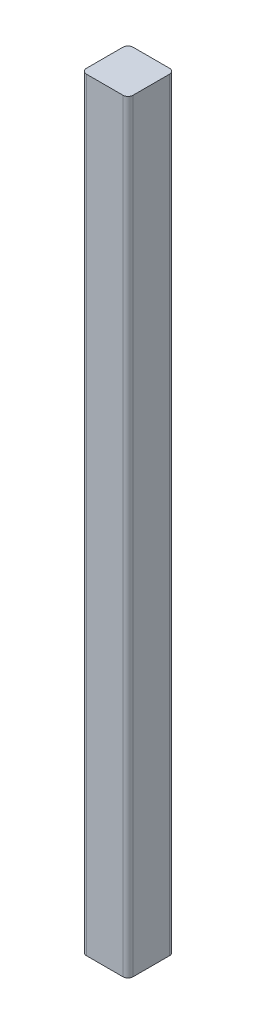
ISO-10303-21;
HEADER;
FILE_DESCRIPTION(('STEP AP214'),'2;1');
FILE_NAME('part.step','',(''),(''),'','','');
FILE_SCHEMA(('AUTOMOTIVE_DESIGN { 1 0 10303 214 1 1 1 1 }'));
ENDSEC;
DATA;
#1=APPLICATION_CONTEXT('core data for automotive mechanical design processes');
#2=APPLICATION_PROTOCOL_DEFINITION('international standard','automotive_design',2000,#1);
#3=PRODUCT_CONTEXT('',#1,'mechanical');
#4=PRODUCT('Part','Part','',(#3));
#5=PRODUCT_RELATED_PRODUCT_CATEGORY('part','',(#4));
#6=PRODUCT_DEFINITION_FORMATION('','',#4);
#7=PRODUCT_DEFINITION_CONTEXT('part definition',#1,'design');
#8=PRODUCT_DEFINITION('design','',#6,#7);
#9=PRODUCT_DEFINITION_SHAPE('','',#8);
#10=(LENGTH_UNIT() NAMED_UNIT(*) SI_UNIT(.MILLI.,.METRE.));
#11=(NAMED_UNIT(*) PLANE_ANGLE_UNIT() SI_UNIT($,.RADIAN.));
#12=(NAMED_UNIT(*) SI_UNIT($,.STERADIAN.) SOLID_ANGLE_UNIT());
#13=UNCERTAINTY_MEASURE_WITH_UNIT(LENGTH_MEASURE(1.E-05),#10,'distance_accuracy_value','');
#14=(GEOMETRIC_REPRESENTATION_CONTEXT(3) GLOBAL_UNCERTAINTY_ASSIGNED_CONTEXT((#13)) GLOBAL_UNIT_ASSIGNED_CONTEXT((#10,
#11,#12)) REPRESENTATION_CONTEXT('',''));
#15=CARTESIAN_POINT('',(0.,0.,0.));
#16=DIRECTION('',(0.,0.,1.));
#17=DIRECTION('',(1.,0.,0.));
#18=AXIS2_PLACEMENT_3D('',#15,#16,#17);
#19=CARTESIAN_POINT('',(22.8,419.01,2.8));
#20=DIRECTION('',(0.,-1.,0.));
#21=DIRECTION('',(0.,0.,-1.));
#22=AXIS2_PLACEMENT_3D('',#19,#20,#21);
#23=CYLINDRICAL_SURFACE('',#22,2.8);
#24=CARTESIAN_POINT('',(22.8,0.,2.8));
#25=DIRECTION('',(0.,1.,0.));
#26=DIRECTION('',(0.,0.,-1.));
#27=AXIS2_PLACEMENT_3D('',#24,#25,#26);
#28=CIRCLE('',#27,2.8);
#29=CARTESIAN_POINT('',(25.6,0.,2.80000000000002));
#30=VERTEX_POINT('',#29);
#31=CARTESIAN_POINT('',(22.8,0.,0.));
#32=VERTEX_POINT('',#31);
#33=EDGE_CURVE('E140',#30,#32,#28,.T.);
#34=ORIENTED_EDGE('',*,*,#33,.T.);
#35=DIRECTION('',(0.,-1.,0.));
#36=VECTOR('',#35,1.);
#37=CARTESIAN_POINT('',(22.8,419.01,0.));
#38=LINE('',#37,#36);
#39=CARTESIAN_POINT('',(22.8,419.01,0.));
#40=VERTEX_POINT('',#39);
#41=EDGE_CURVE('E11',#40,#32,#38,.T.);
#42=ORIENTED_EDGE('',*,*,#41,.F.);
#43=CARTESIAN_POINT('',(22.8,419.01,2.8));
#44=DIRECTION('',(0.,1.,0.));
#45=DIRECTION('',(0.,0.,-1.));
#46=AXIS2_PLACEMENT_3D('',#43,#44,#45);
#47=CIRCLE('',#46,2.8);
#48=CARTESIAN_POINT('',(25.6,419.01,2.80000000000002));
#49=VERTEX_POINT('',#48);
#50=EDGE_CURVE('E156',#49,#40,#47,.T.);
#51=ORIENTED_EDGE('',*,*,#50,.F.);
#52=DIRECTION('',(0.,-1.,0.));
#53=VECTOR('',#52,1.);
#54=CARTESIAN_POINT('',(25.6,419.01,2.80000000000002));
#55=LINE('',#54,#53);
#56=EDGE_CURVE('E136',#49,#30,#55,.T.);
#57=ORIENTED_EDGE('',*,*,#56,.T.);
#58=EDGE_LOOP('',(#34,#42,#51,#57));
#59=FACE_BOUND('',#58,.T.);
#60=ADVANCED_FACE('F32',(#59),#23,.T.);
#61=CARTESIAN_POINT('',(2.80000000000002,419.01,0.));
#62=DIRECTION('',(0.,0.,1.));
#63=DIRECTION('',(1.,0.,0.));
#64=AXIS2_PLACEMENT_3D('',#61,#62,#63);
#65=PLANE('',#64);
#66=DIRECTION('',(-1.,0.,0.));
#67=VECTOR('',#66,1.);
#68=CARTESIAN_POINT('',(2.80000000000002,0.,0.));
#69=LINE('',#68,#67);
#70=CARTESIAN_POINT('',(2.80000000000002,0.,0.));
#71=VERTEX_POINT('',#70);
#72=EDGE_CURVE('E143',#32,#71,#69,.T.);
#73=ORIENTED_EDGE('',*,*,#72,.T.);
#74=DIRECTION('',(0.,-1.,0.));
#75=VECTOR('',#74,1.);
#76=CARTESIAN_POINT('',(2.80000000000002,419.01,0.));
#77=LINE('',#76,#75);
#78=CARTESIAN_POINT('',(2.80000000000002,419.01,0.));
#79=VERTEX_POINT('',#78);
#80=EDGE_CURVE('E39',#79,#71,#77,.T.);
#81=ORIENTED_EDGE('',*,*,#80,.F.);
#82=DIRECTION('',(-1.,0.,0.));
#83=VECTOR('',#82,1.);
#84=CARTESIAN_POINT('',(2.80000000000002,419.01,0.));
#85=LINE('',#84,#83);
#86=EDGE_CURVE('E96',#40,#79,#85,.T.);
#87=ORIENTED_EDGE('',*,*,#86,.F.);
#88=ORIENTED_EDGE('',*,*,#41,.T.);
#89=EDGE_LOOP('',(#73,#81,#87,#88));
#90=FACE_BOUND('',#89,.T.);
#91=ADVANCED_FACE('F259',(#90),#65,.F.);
#92=CARTESIAN_POINT('',(2.8,419.01,2.8));
#93=DIRECTION('',(0.,-1.,0.));
#94=DIRECTION('',(0.,0.,-1.));
#95=AXIS2_PLACEMENT_3D('',#92,#93,#94);
#96=CYLINDRICAL_SURFACE('',#95,2.8);
#97=CARTESIAN_POINT('',(2.8,0.,2.8));
#98=DIRECTION('',(0.,1.,0.));
#99=DIRECTION('',(0.,0.,1.));
#100=AXIS2_PLACEMENT_3D('',#97,#98,#99);
#101=CIRCLE('',#100,2.8);
#102=CARTESIAN_POINT('',(0.,0.,2.80000000000002));
#103=VERTEX_POINT('',#102);
#104=EDGE_CURVE('E146',#71,#103,#101,.T.);
#105=ORIENTED_EDGE('',*,*,#104,.T.);
#106=DIRECTION('',(0.,-1.,0.));
#107=VECTOR('',#106,1.);
#108=CARTESIAN_POINT('',(0.,419.01,2.80000000000002));
#109=LINE('',#108,#107);
#110=CARTESIAN_POINT('',(0.,419.01,2.80000000000002));
#111=VERTEX_POINT('',#110);
#112=EDGE_CURVE('E163',#111,#103,#109,.T.);
#113=ORIENTED_EDGE('',*,*,#112,.F.);
#114=CARTESIAN_POINT('',(2.8,419.01,2.8));
#115=DIRECTION('',(0.,1.,0.));
#116=DIRECTION('',(0.,0.,1.));
#117=AXIS2_PLACEMENT_3D('',#114,#115,#116);
#118=CIRCLE('',#117,2.8);
#119=EDGE_CURVE('E171',#79,#111,#118,.T.);
#120=ORIENTED_EDGE('',*,*,#119,.F.);
#121=ORIENTED_EDGE('',*,*,#80,.T.);
#122=EDGE_LOOP('',(#105,#113,#120,#121));
#123=FACE_BOUND('',#122,.T.);
#124=ADVANCED_FACE('F169',(#123),#96,.T.);
#125=CARTESIAN_POINT('',(0.,419.01,2.80000000000002));
#126=DIRECTION('',(1.,0.,0.));
#127=DIRECTION('',(0.,0.,-1.));
#128=AXIS2_PLACEMENT_3D('',#125,#126,#127);
#129=PLANE('',#128);
#130=DIRECTION('',(0.,0.,1.));
#131=VECTOR('',#130,1.);
#132=CARTESIAN_POINT('',(0.,0.,2.80000000000002));
#133=LINE('',#132,#131);
#134=CARTESIAN_POINT('',(0.,0.,22.8));
#135=VERTEX_POINT('',#134);
#136=EDGE_CURVE('E148',#103,#135,#133,.T.);
#137=ORIENTED_EDGE('',*,*,#136,.T.);
#138=DIRECTION('',(0.,-1.,0.));
#139=VECTOR('',#138,1.);
#140=CARTESIAN_POINT('',(0.,419.01,22.8));
#141=LINE('',#140,#139);
#142=CARTESIAN_POINT('',(0.,419.01,22.8));
#143=VERTEX_POINT('',#142);
#144=EDGE_CURVE('E160',#143,#135,#141,.T.);
#145=ORIENTED_EDGE('',*,*,#144,.F.);
#146=DIRECTION('',(0.,0.,1.));
#147=VECTOR('',#146,1.);
#148=CARTESIAN_POINT('',(0.,419.01,2.80000000000002));
#149=LINE('',#148,#147);
#150=EDGE_CURVE('E183',#111,#143,#149,.T.);
#151=ORIENTED_EDGE('',*,*,#150,.F.);
#152=ORIENTED_EDGE('',*,*,#112,.T.);
#153=EDGE_LOOP('',(#137,#145,#151,#152));
#154=FACE_BOUND('',#153,.T.);
#155=ADVANCED_FACE('F179',(#154),#129,.F.);
#156=CARTESIAN_POINT('',(2.8,419.01,22.8));
#157=DIRECTION('',(0.,-1.,0.));
#158=DIRECTION('',(0.,0.,-1.));
#159=AXIS2_PLACEMENT_3D('',#156,#157,#158);
#160=CYLINDRICAL_SURFACE('',#159,2.8);
#161=CARTESIAN_POINT('',(2.8,0.,22.8));
#162=DIRECTION('',(0.,1.,0.));
#163=DIRECTION('',(0.,0.,1.));
#164=AXIS2_PLACEMENT_3D('',#161,#162,#163);
#165=CIRCLE('',#164,2.8);
#166=CARTESIAN_POINT('',(2.80000000000002,0.,25.6));
#167=VERTEX_POINT('',#166);
#168=EDGE_CURVE('E150',#135,#167,#165,.T.);
#169=ORIENTED_EDGE('',*,*,#168,.T.);
#170=DIRECTION('',(0.,-1.,0.));
#171=VECTOR('',#170,1.);
#172=CARTESIAN_POINT('',(2.80000000000002,419.01,25.6));
#173=LINE('',#172,#171);
#174=CARTESIAN_POINT('',(2.80000000000002,419.01,25.6));
#175=VERTEX_POINT('',#174);
#176=EDGE_CURVE('E131',#175,#167,#173,.T.);
#177=ORIENTED_EDGE('',*,*,#176,.F.);
#178=CARTESIAN_POINT('',(2.8,419.01,22.8));
#179=DIRECTION('',(0.,1.,0.));
#180=DIRECTION('',(0.,0.,1.));
#181=AXIS2_PLACEMENT_3D('',#178,#179,#180);
#182=CIRCLE('',#181,2.8);
#183=EDGE_CURVE('E119',#143,#175,#182,.T.);
#184=ORIENTED_EDGE('',*,*,#183,.F.);
#185=ORIENTED_EDGE('',*,*,#144,.T.);
#186=EDGE_LOOP('',(#169,#177,#184,#185));
#187=FACE_BOUND('',#186,.T.);
#188=ADVANCED_FACE('F182',(#187),#160,.T.);
#189=CARTESIAN_POINT('',(2.80000000000002,419.01,25.6));
#190=DIRECTION('',(0.,0.,-1.));
#191=DIRECTION('',(-1.,0.,0.));
#192=AXIS2_PLACEMENT_3D('',#189,#190,#191);
#193=PLANE('',#192);
#194=DIRECTION('',(1.,0.,0.));
#195=VECTOR('',#194,1.);
#196=CARTESIAN_POINT('',(2.80000000000002,0.,25.6));
#197=LINE('',#196,#195);
#198=CARTESIAN_POINT('',(22.8,0.,25.6));
#199=VERTEX_POINT('',#198);
#200=EDGE_CURVE('E128',#167,#199,#197,.T.);
#201=ORIENTED_EDGE('',*,*,#200,.T.);
#202=DIRECTION('',(0.,-1.,0.));
#203=VECTOR('',#202,1.);
#204=CARTESIAN_POINT('',(22.8,419.01,25.6));
#205=LINE('',#204,#203);
#206=CARTESIAN_POINT('',(22.8,419.01,25.6));
#207=VERTEX_POINT('',#206);
#208=EDGE_CURVE('E125',#207,#199,#205,.T.);
#209=ORIENTED_EDGE('',*,*,#208,.F.);
#210=DIRECTION('',(1.,0.,0.));
#211=VECTOR('',#210,1.);
#212=CARTESIAN_POINT('',(2.80000000000002,419.01,25.6));
#213=LINE('',#212,#211);
#214=EDGE_CURVE('E112',#175,#207,#213,.T.);
#215=ORIENTED_EDGE('',*,*,#214,.F.);
#216=ORIENTED_EDGE('',*,*,#176,.T.);
#217=EDGE_LOOP('',(#201,#209,#215,#216));
#218=FACE_BOUND('',#217,.T.);
#219=ADVANCED_FACE('F126',(#218),#193,.F.);
#220=CARTESIAN_POINT('',(22.8,419.01,22.8));
#221=DIRECTION('',(0.,-1.,0.));
#222=DIRECTION('',(0.,0.,-1.));
#223=AXIS2_PLACEMENT_3D('',#220,#221,#222);
#224=CYLINDRICAL_SURFACE('',#223,2.8);
#225=CARTESIAN_POINT('',(22.8,0.,22.8));
#226=DIRECTION('',(0.,1.,0.));
#227=DIRECTION('',(0.,0.,1.));
#228=AXIS2_PLACEMENT_3D('',#225,#226,#227);
#229=CIRCLE('',#228,2.8);
#230=CARTESIAN_POINT('',(25.6,0.,22.8));
#231=VERTEX_POINT('',#230);
#232=EDGE_CURVE('E153',#199,#231,#229,.T.);
#233=ORIENTED_EDGE('',*,*,#232,.T.);
#234=DIRECTION('',(0.,-1.,0.));
#235=VECTOR('',#234,1.);
#236=CARTESIAN_POINT('',(25.6,419.01,22.8));
#237=LINE('',#236,#235);
#238=CARTESIAN_POINT('',(25.6,419.01,22.8));
#239=VERTEX_POINT('',#238);
#240=EDGE_CURVE('E132',#239,#231,#237,.T.);
#241=ORIENTED_EDGE('',*,*,#240,.F.);
#242=CARTESIAN_POINT('',(22.8,419.01,22.8));
#243=DIRECTION('',(0.,1.,0.));
#244=DIRECTION('',(0.,0.,1.));
#245=AXIS2_PLACEMENT_3D('',#242,#243,#244);
#246=CIRCLE('',#245,2.8);
#247=EDGE_CURVE('E116',#207,#239,#246,.T.);
#248=ORIENTED_EDGE('',*,*,#247,.F.);
#249=ORIENTED_EDGE('',*,*,#208,.T.);
#250=EDGE_LOOP('',(#233,#241,#248,#249));
#251=FACE_BOUND('',#250,.T.);
#252=ADVANCED_FACE('F134',(#251),#224,.T.);
#253=CARTESIAN_POINT('',(25.6,419.01,2.80000000000002));
#254=DIRECTION('',(-1.,0.,0.));
#255=DIRECTION('',(0.,0.,1.));
#256=AXIS2_PLACEMENT_3D('',#253,#254,#255);
#257=PLANE('',#256);
#258=DIRECTION('',(0.,0.,-1.));
#259=VECTOR('',#258,1.);
#260=CARTESIAN_POINT('',(25.6,0.,2.80000000000002));
#261=LINE('',#260,#259);
#262=EDGE_CURVE('E88',#231,#30,#261,.T.);
#263=ORIENTED_EDGE('',*,*,#262,.T.);
#264=ORIENTED_EDGE('',*,*,#56,.F.);
#265=DIRECTION('',(0.,0.,-1.));
#266=VECTOR('',#265,1.);
#267=CARTESIAN_POINT('',(25.6,419.01,2.80000000000002));
#268=LINE('',#267,#266);
#269=EDGE_CURVE('E55',#239,#49,#268,.T.);
#270=ORIENTED_EDGE('',*,*,#269,.F.);
#271=ORIENTED_EDGE('',*,*,#240,.T.);
#272=EDGE_LOOP('',(#263,#264,#270,#271));
#273=FACE_BOUND('',#272,.T.);
#274=ADVANCED_FACE('F266',(#273),#257,.F.);
#275=CARTESIAN_POINT('',(22.8,419.01,2.8));
#276=DIRECTION('',(0.,-1.,0.));
#277=DIRECTION('',(0.,0.,-1.));
#278=AXIS2_PLACEMENT_3D('',#275,#276,#277);
#279=PLANE('',#278);
#280=ORIENTED_EDGE('',*,*,#50,.T.);
#281=ORIENTED_EDGE('',*,*,#86,.T.);
#282=ORIENTED_EDGE('',*,*,#119,.T.);
#283=ORIENTED_EDGE('',*,*,#150,.T.);
#284=ORIENTED_EDGE('',*,*,#183,.T.);
#285=ORIENTED_EDGE('',*,*,#214,.T.);
#286=ORIENTED_EDGE('',*,*,#247,.T.);
#287=ORIENTED_EDGE('',*,*,#269,.T.);
#288=EDGE_LOOP('',(#280,#281,#282,#283,#284,#285,#286,#287));
#289=FACE_BOUND('',#288,.T.);
#290=ADVANCED_FACE('F114',(#289),#279,.F.);
#291=CARTESIAN_POINT('',(22.8,0.,2.8));
#292=DIRECTION('',(0.,-1.,0.));
#293=DIRECTION('',(0.,0.,-1.));
#294=AXIS2_PLACEMENT_3D('',#291,#292,#293);
#295=PLANE('',#294);
#296=DIRECTION('',(0.,0.,1.));
#297=VECTOR('',#296,1.);
#298=CARTESIAN_POINT('',(22.8,0.,2.8));
#299=LINE('',#298,#297);
#300=CARTESIAN_POINT('',(22.8,0.,2.8));
#301=VERTEX_POINT('',#300);
#302=CARTESIAN_POINT('',(22.8,0.,22.8));
#303=VERTEX_POINT('',#302);
#304=EDGE_CURVE('E46',#301,#303,#299,.T.);
#305=ORIENTED_EDGE('',*,*,#304,.F.);
#306=DIRECTION('',(1.,0.,0.));
#307=VECTOR('',#306,1.);
#308=CARTESIAN_POINT('',(2.8,0.,2.8));
#309=LINE('',#308,#307);
#310=CARTESIAN_POINT('',(2.8,0.,2.8));
#311=VERTEX_POINT('',#310);
#312=EDGE_CURVE('E199',#311,#301,#309,.T.);
#313=ORIENTED_EDGE('',*,*,#312,.F.);
#314=DIRECTION('',(0.,0.,-1.));
#315=VECTOR('',#314,1.);
#316=CARTESIAN_POINT('',(2.8,0.,2.8));
#317=LINE('',#316,#315);
#318=CARTESIAN_POINT('',(2.8,0.,22.8));
#319=VERTEX_POINT('',#318);
#320=EDGE_CURVE('E203',#319,#311,#317,.T.);
#321=ORIENTED_EDGE('',*,*,#320,.F.);
#322=DIRECTION('',(-1.,0.,0.));
#323=VECTOR('',#322,1.);
#324=CARTESIAN_POINT('',(2.8,0.,22.8));
#325=LINE('',#324,#323);
#326=EDGE_CURVE('E206',#303,#319,#325,.T.);
#327=ORIENTED_EDGE('',*,*,#326,.F.);
#328=EDGE_LOOP('',(#305,#313,#321,#327));
#329=FACE_BOUND('',#328,.T.);
#330=ORIENTED_EDGE('',*,*,#33,.F.);
#331=ORIENTED_EDGE('',*,*,#262,.F.);
#332=ORIENTED_EDGE('',*,*,#232,.F.);
#333=ORIENTED_EDGE('',*,*,#200,.F.);
#334=ORIENTED_EDGE('',*,*,#168,.F.);
#335=ORIENTED_EDGE('',*,*,#136,.F.);
#336=ORIENTED_EDGE('',*,*,#104,.F.);
#337=ORIENTED_EDGE('',*,*,#72,.F.);
#338=EDGE_LOOP('',(#330,#331,#332,#333,#334,#335,#336,#337));
#339=FACE_BOUND('',#338,.T.);
#340=ADVANCED_FACE('F175',(#329,#339),#295,.T.);
#341=CARTESIAN_POINT('',(22.8,408.5,2.8));
#342=DIRECTION('',(1.,0.,0.));
#343=DIRECTION('',(0.,0.,-1.));
#344=AXIS2_PLACEMENT_3D('',#341,#342,#343);
#345=PLANE('',#344);
#346=ORIENTED_EDGE('',*,*,#304,.T.);
#347=DIRECTION('',(0.,-1.,0.));
#348=VECTOR('',#347,1.);
#349=CARTESIAN_POINT('',(22.8,408.5,22.8));
#350=LINE('',#349,#348);
#351=CARTESIAN_POINT('',(22.8,408.5,22.8));
#352=VERTEX_POINT('',#351);
#353=EDGE_CURVE('E189',#352,#303,#350,.T.);
#354=ORIENTED_EDGE('',*,*,#353,.F.);
#355=DIRECTION('',(0.,0.,1.));
#356=VECTOR('',#355,1.);
#357=CARTESIAN_POINT('',(22.8,408.5,2.8));
#358=LINE('',#357,#356);
#359=CARTESIAN_POINT('',(22.8,408.5,2.8));
#360=VERTEX_POINT('',#359);
#361=EDGE_CURVE('E202',#360,#352,#358,.T.);
#362=ORIENTED_EDGE('',*,*,#361,.F.);
#363=DIRECTION('',(0.,-1.,0.));
#364=VECTOR('',#363,1.);
#365=CARTESIAN_POINT('',(22.8,408.5,2.8));
#366=LINE('',#365,#364);
#367=EDGE_CURVE('E144',#360,#301,#366,.T.);
#368=ORIENTED_EDGE('',*,*,#367,.T.);
#369=EDGE_LOOP('',(#346,#354,#362,#368));
#370=FACE_BOUND('',#369,.T.);
#371=ADVANCED_FACE('F227',(#370),#345,.F.);
#372=CARTESIAN_POINT('',(2.8,408.5,2.8));
#373=DIRECTION('',(0.,0.,-1.));
#374=DIRECTION('',(-1.,0.,0.));
#375=AXIS2_PLACEMENT_3D('',#372,#373,#374);
#376=PLANE('',#375);
#377=ORIENTED_EDGE('',*,*,#312,.T.);
#378=ORIENTED_EDGE('',*,*,#367,.F.);
#379=DIRECTION('',(1.,0.,0.));
#380=VECTOR('',#379,1.);
#381=CARTESIAN_POINT('',(2.8,408.5,2.8));
#382=LINE('',#381,#380);
#383=CARTESIAN_POINT('',(2.8,408.5,2.8));
#384=VERTEX_POINT('',#383);
#385=EDGE_CURVE('E192',#384,#360,#382,.T.);
#386=ORIENTED_EDGE('',*,*,#385,.F.);
#387=DIRECTION('',(0.,-1.,0.));
#388=VECTOR('',#387,1.);
#389=CARTESIAN_POINT('',(2.8,408.5,2.8));
#390=LINE('',#389,#388);
#391=EDGE_CURVE('E195',#384,#311,#390,.T.);
#392=ORIENTED_EDGE('',*,*,#391,.T.);
#393=EDGE_LOOP('',(#377,#378,#386,#392));
#394=FACE_BOUND('',#393,.T.);
#395=ADVANCED_FACE('F238',(#394),#376,.F.);
#396=CARTESIAN_POINT('',(2.8,408.5,2.8));
#397=DIRECTION('',(-1.,0.,0.));
#398=DIRECTION('',(0.,0.,1.));
#399=AXIS2_PLACEMENT_3D('',#396,#397,#398);
#400=PLANE('',#399);
#401=ORIENTED_EDGE('',*,*,#320,.T.);
#402=ORIENTED_EDGE('',*,*,#391,.F.);
#403=DIRECTION('',(0.,0.,-1.));
#404=VECTOR('',#403,1.);
#405=CARTESIAN_POINT('',(2.8,408.5,2.8));
#406=LINE('',#405,#404);
#407=CARTESIAN_POINT('',(2.8,408.5,22.8));
#408=VERTEX_POINT('',#407);
#409=EDGE_CURVE('E212',#408,#384,#406,.T.);
#410=ORIENTED_EDGE('',*,*,#409,.F.);
#411=DIRECTION('',(0.,-1.,0.));
#412=VECTOR('',#411,1.);
#413=CARTESIAN_POINT('',(2.8,408.5,22.8));
#414=LINE('',#413,#412);
#415=EDGE_CURVE('E191',#408,#319,#414,.T.);
#416=ORIENTED_EDGE('',*,*,#415,.T.);
#417=EDGE_LOOP('',(#401,#402,#410,#416));
#418=FACE_BOUND('',#417,.T.);
#419=ADVANCED_FACE('F243',(#418),#400,.F.);
#420=CARTESIAN_POINT('',(2.8,408.5,22.8));
#421=DIRECTION('',(0.,0.,1.));
#422=DIRECTION('',(1.,0.,0.));
#423=AXIS2_PLACEMENT_3D('',#420,#421,#422);
#424=PLANE('',#423);
#425=ORIENTED_EDGE('',*,*,#326,.T.);
#426=ORIENTED_EDGE('',*,*,#415,.F.);
#427=DIRECTION('',(-1.,0.,0.));
#428=VECTOR('',#427,1.);
#429=CARTESIAN_POINT('',(2.8,408.5,22.8));
#430=LINE('',#429,#428);
#431=EDGE_CURVE('E215',#352,#408,#430,.T.);
#432=ORIENTED_EDGE('',*,*,#431,.F.);
#433=ORIENTED_EDGE('',*,*,#353,.T.);
#434=EDGE_LOOP('',(#425,#426,#432,#433));
#435=FACE_BOUND('',#434,.T.);
#436=ADVANCED_FACE('F248',(#435),#424,.F.);
#437=CARTESIAN_POINT('',(0.,408.5,0.));
#438=DIRECTION('',(0.,1.,0.));
#439=DIRECTION('',(0.,0.,1.));
#440=AXIS2_PLACEMENT_3D('',#437,#438,#439);
#441=PLANE('',#440);
#442=ORIENTED_EDGE('',*,*,#361,.T.);
#443=ORIENTED_EDGE('',*,*,#431,.T.);
#444=ORIENTED_EDGE('',*,*,#409,.T.);
#445=ORIENTED_EDGE('',*,*,#385,.T.);
#446=EDGE_LOOP('',(#442,#443,#444,#445));
#447=FACE_BOUND('',#446,.T.);
#448=ADVANCED_FACE('F222',(#447),#441,.F.);
#449=CLOSED_SHELL('',(#60,#91,#124,#155,#188,#219,#252,#274,#290,#340,#371,#395,#419,#436,#448));
#450=MANIFOLD_SOLID_BREP('B2',#449);
#451=ADVANCED_BREP_SHAPE_REPRESENTATION('',(#18,#450),#14);
#452=SHAPE_DEFINITION_REPRESENTATION(#9,#451);
ENDSEC;
END-ISO-10303-21;
